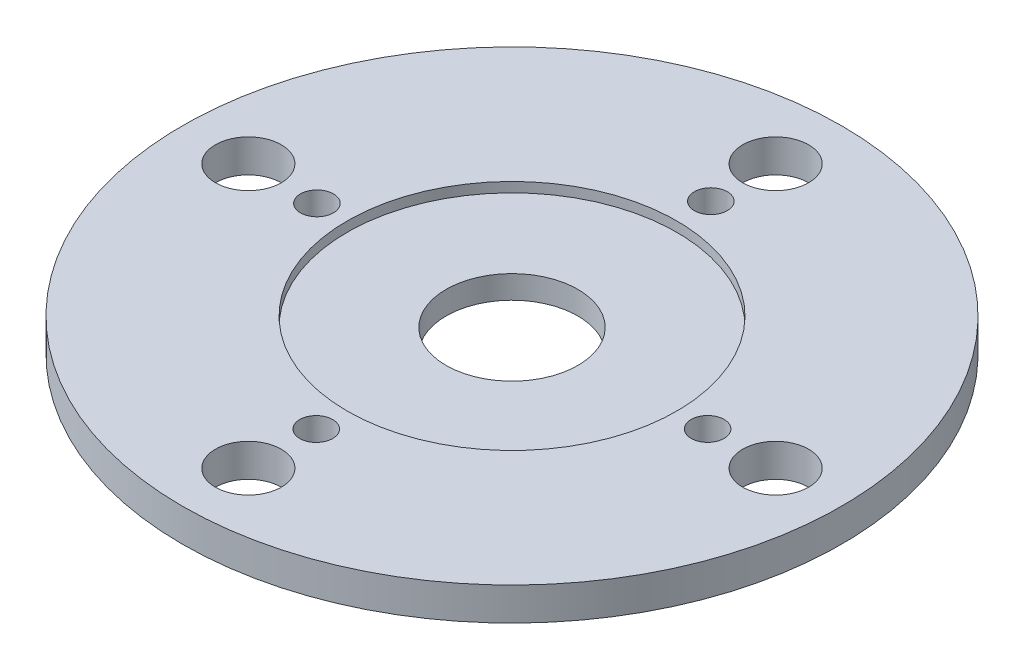
ISO-10303-21;
HEADER;
FILE_DESCRIPTION(('STEP AP214'),'2;1');
FILE_NAME('part.step','',(''),(''),'','','');
FILE_SCHEMA(('AUTOMOTIVE_DESIGN { 1 0 10303 214 1 1 1 1 }'));
ENDSEC;
DATA;
#1=APPLICATION_CONTEXT('core data for automotive mechanical design processes');
#2=APPLICATION_PROTOCOL_DEFINITION('international standard','automotive_design',2000,#1);
#3=PRODUCT_CONTEXT('',#1,'mechanical');
#4=PRODUCT('Part','Part','',(#3));
#5=PRODUCT_RELATED_PRODUCT_CATEGORY('part','',(#4));
#6=PRODUCT_DEFINITION_FORMATION('','',#4);
#7=PRODUCT_DEFINITION_CONTEXT('part definition',#1,'design');
#8=PRODUCT_DEFINITION('design','',#6,#7);
#9=PRODUCT_DEFINITION_SHAPE('','',#8);
#10=(LENGTH_UNIT() NAMED_UNIT(*) SI_UNIT(.MILLI.,.METRE.));
#11=(NAMED_UNIT(*) PLANE_ANGLE_UNIT() SI_UNIT($,.RADIAN.));
#12=(NAMED_UNIT(*) SI_UNIT($,.STERADIAN.) SOLID_ANGLE_UNIT());
#13=UNCERTAINTY_MEASURE_WITH_UNIT(LENGTH_MEASURE(1.E-05),#10,'distance_accuracy_value','');
#14=(GEOMETRIC_REPRESENTATION_CONTEXT(3) GLOBAL_UNCERTAINTY_ASSIGNED_CONTEXT((#13)) GLOBAL_UNIT_ASSIGNED_CONTEXT((#10,
#11,#12)) REPRESENTATION_CONTEXT('',''));
#15=CARTESIAN_POINT('',(0.,0.,0.));
#16=DIRECTION('',(0.,0.,1.));
#17=DIRECTION('',(1.,0.,0.));
#18=AXIS2_PLACEMENT_3D('',#15,#16,#17);
#19=CARTESIAN_POINT('',(0.,1.,0.));
#20=DIRECTION('',(0.,-1.,0.));
#21=DIRECTION('',(0.,0.,-1.));
#22=AXIS2_PLACEMENT_3D('',#19,#20,#21);
#23=CYLINDRICAL_SURFACE('',#22,2.);
#24=CARTESIAN_POINT('',(0.,0.,0.));
#25=DIRECTION('',(0.,1.,0.));
#26=DIRECTION('',(0.,0.,1.));
#27=AXIS2_PLACEMENT_3D('',#24,#25,#26);
#28=CIRCLE('',#27,2.);
#29=CARTESIAN_POINT('',(0.,0.,2.));
#30=VERTEX_POINT('',#29);
#31=EDGE_CURVE('E43',#30,#30,#28,.T.);
#32=ORIENTED_EDGE('',*,*,#31,.F.);
#33=EDGE_LOOP('',(#32));
#34=FACE_BOUND('',#33,.T.);
#35=CARTESIAN_POINT('',(0.,0.7,0.));
#36=DIRECTION('',(0.,1.,0.));
#37=DIRECTION('',(0.,0.,1.));
#38=AXIS2_PLACEMENT_3D('',#35,#36,#37);
#39=CIRCLE('',#38,2.);
#40=CARTESIAN_POINT('',(0.,0.7,2.));
#41=VERTEX_POINT('',#40);
#42=EDGE_CURVE('E34',#41,#41,#39,.T.);
#43=ORIENTED_EDGE('',*,*,#42,.T.);
#44=EDGE_LOOP('',(#43));
#45=FACE_BOUND('',#44,.T.);
#46=ADVANCED_FACE('F30',(#34,#45),#23,.F.);
#47=CARTESIAN_POINT('',(0.,1.,0.));
#48=DIRECTION('',(0.,1.,0.));
#49=DIRECTION('',(0.,0.,1.));
#50=AXIS2_PLACEMENT_3D('',#47,#48,#49);
#51=PLANE('',#50);
#52=CARTESIAN_POINT('',(0.,1.,0.));
#53=DIRECTION('',(0.,1.,0.));
#54=DIRECTION('',(0.,0.,1.));
#55=AXIS2_PLACEMENT_3D('',#52,#53,#54);
#56=CIRCLE('',#55,5.);
#57=CARTESIAN_POINT('',(0.,1.,5.));
#58=VERTEX_POINT('',#57);
#59=EDGE_CURVE('E95',#58,#58,#56,.T.);
#60=ORIENTED_EDGE('',*,*,#59,.F.);
#61=EDGE_LOOP('',(#60));
#62=FACE_BOUND('',#61,.T.);
#63=CARTESIAN_POINT('',(-2.8421709430404E-11,1.,-6.03335240026581));
#64=DIRECTION('',(0.,1.,0.));
#65=DIRECTION('',(0.,0.,1.));
#66=AXIS2_PLACEMENT_3D('',#63,#64,#65);
#67=CIRCLE('',#66,0.499999999999999);
#68=CARTESIAN_POINT('',(-2.8421709430404E-11,1.,-5.53335240026581));
#69=VERTEX_POINT('',#68);
#70=EDGE_CURVE('E81',#69,#69,#67,.T.);
#71=ORIENTED_EDGE('',*,*,#70,.F.);
#72=EDGE_LOOP('',(#71));
#73=FACE_BOUND('',#72,.T.);
#74=CARTESIAN_POINT('',(5.93682324591782,1.,-2.8421709430404E-11));
#75=DIRECTION('',(0.,1.,0.));
#76=DIRECTION('',(0.,0.,-1.));
#77=AXIS2_PLACEMENT_3D('',#74,#75,#76);
#78=CIRCLE('',#77,0.5);
#79=CARTESIAN_POINT('',(5.93682324591782,1.,-0.500000000028421));
#80=VERTEX_POINT('',#79);
#81=EDGE_CURVE('E69',#80,#80,#78,.T.);
#82=ORIENTED_EDGE('',*,*,#81,.F.);
#83=EDGE_LOOP('',(#82));
#84=FACE_BOUND('',#83,.T.);
#85=CARTESIAN_POINT('',(0.,1.,5.94141571224327));
#86=DIRECTION('',(0.,1.,0.));
#87=DIRECTION('',(0.,0.,-1.));
#88=AXIS2_PLACEMENT_3D('',#85,#86,#87);
#89=CIRCLE('',#88,0.500000000000001);
#90=CARTESIAN_POINT('',(0.,1.,5.44141571224327));
#91=VERTEX_POINT('',#90);
#92=EDGE_CURVE('E57',#91,#91,#89,.T.);
#93=ORIENTED_EDGE('',*,*,#92,.F.);
#94=EDGE_LOOP('',(#93));
#95=FACE_BOUND('',#94,.T.);
#96=CARTESIAN_POINT('',(-8.,1.,0.));
#97=DIRECTION('',(0.,1.,0.));
#98=DIRECTION('',(0.,0.,1.));
#99=AXIS2_PLACEMENT_3D('',#96,#97,#98);
#100=CIRCLE('',#99,1.);
#101=CARTESIAN_POINT('',(-8.,1.,1.));
#102=VERTEX_POINT('',#101);
#103=EDGE_CURVE('E47',#102,#102,#100,.T.);
#104=ORIENTED_EDGE('',*,*,#103,.F.);
#105=EDGE_LOOP('',(#104));
#106=FACE_BOUND('',#105,.T.);
#107=CARTESIAN_POINT('',(0.,1.,0.));
#108=DIRECTION('',(0.,1.,0.));
#109=DIRECTION('',(0.,0.,1.));
#110=AXIS2_PLACEMENT_3D('',#107,#108,#109);
#111=CIRCLE('',#110,10.);
#112=CARTESIAN_POINT('',(0.,1.,10.));
#113=VERTEX_POINT('',#112);
#114=EDGE_CURVE('E10',#113,#113,#111,.T.);
#115=ORIENTED_EDGE('',*,*,#114,.T.);
#116=EDGE_LOOP('',(#115));
#117=FACE_BOUND('',#116,.T.);
#118=CARTESIAN_POINT('',(-5.91917261272101,1.,0.));
#119=DIRECTION('',(0.,1.,0.));
#120=DIRECTION('',(0.,0.,1.));
#121=AXIS2_PLACEMENT_3D('',#118,#119,#120);
#122=CIRCLE('',#121,0.5);
#123=CARTESIAN_POINT('',(-5.91917261272101,1.,0.5));
#124=VERTEX_POINT('',#123);
#125=EDGE_CURVE('E51',#124,#124,#122,.T.);
#126=ORIENTED_EDGE('',*,*,#125,.F.);
#127=EDGE_LOOP('',(#126));
#128=FACE_BOUND('',#127,.T.);
#129=CARTESIAN_POINT('',(0.,1.,8.));
#130=DIRECTION('',(0.,1.,0.));
#131=DIRECTION('',(0.,0.,-1.));
#132=AXIS2_PLACEMENT_3D('',#129,#130,#131);
#133=CIRCLE('',#132,1.);
#134=CARTESIAN_POINT('',(0.,1.,7.));
#135=VERTEX_POINT('',#134);
#136=EDGE_CURVE('E63',#135,#135,#133,.T.);
#137=ORIENTED_EDGE('',*,*,#136,.F.);
#138=EDGE_LOOP('',(#137));
#139=FACE_BOUND('',#138,.T.);
#140=CARTESIAN_POINT('',(8.,1.,0.));
#141=DIRECTION('',(0.,1.,0.));
#142=DIRECTION('',(0.,0.,-1.));
#143=AXIS2_PLACEMENT_3D('',#140,#141,#142);
#144=CIRCLE('',#143,1.);
#145=CARTESIAN_POINT('',(8.,1.,-1.));
#146=VERTEX_POINT('',#145);
#147=EDGE_CURVE('E75',#146,#146,#144,.T.);
#148=ORIENTED_EDGE('',*,*,#147,.F.);
#149=EDGE_LOOP('',(#148));
#150=FACE_BOUND('',#149,.T.);
#151=CARTESIAN_POINT('',(0.,1.,-8.));
#152=DIRECTION('',(0.,1.,0.));
#153=DIRECTION('',(0.,0.,1.));
#154=AXIS2_PLACEMENT_3D('',#151,#152,#153);
#155=CIRCLE('',#154,1.);
#156=CARTESIAN_POINT('',(0.,1.,-7.));
#157=VERTEX_POINT('',#156);
#158=EDGE_CURVE('E87',#157,#157,#155,.T.);
#159=ORIENTED_EDGE('',*,*,#158,.F.);
#160=EDGE_LOOP('',(#159));
#161=FACE_BOUND('',#160,.T.);
#162=ADVANCED_FACE('F117',(#62,#73,#84,#95,#106,#117,#128,#139,#150,#161),#51,.T.);
#163=CARTESIAN_POINT('',(0.,0.,0.));
#164=DIRECTION('',(0.,1.,0.));
#165=DIRECTION('',(0.,0.,1.));
#166=AXIS2_PLACEMENT_3D('',#163,#164,#165);
#167=PLANE('',#166);
#168=CARTESIAN_POINT('',(0.,0.,0.));
#169=DIRECTION('',(0.,1.,0.));
#170=DIRECTION('',(0.,0.,1.));
#171=AXIS2_PLACEMENT_3D('',#168,#169,#170);
#172=CIRCLE('',#171,10.);
#173=CARTESIAN_POINT('',(0.,0.,10.));
#174=VERTEX_POINT('',#173);
#175=EDGE_CURVE('E38',#174,#174,#172,.T.);
#176=ORIENTED_EDGE('',*,*,#175,.F.);
#177=EDGE_LOOP('',(#176));
#178=FACE_BOUND('',#177,.T.);
#179=ORIENTED_EDGE('',*,*,#31,.T.);
#180=EDGE_LOOP('',(#179));
#181=FACE_BOUND('',#180,.T.);
#182=CARTESIAN_POINT('',(-8.,0.,0.));
#183=DIRECTION('',(0.,1.,0.));
#184=DIRECTION('',(0.,0.,1.));
#185=AXIS2_PLACEMENT_3D('',#182,#183,#184);
#186=CIRCLE('',#185,1.);
#187=CARTESIAN_POINT('',(-8.,0.,1.));
#188=VERTEX_POINT('',#187);
#189=EDGE_CURVE('E48',#188,#188,#186,.T.);
#190=ORIENTED_EDGE('',*,*,#189,.T.);
#191=EDGE_LOOP('',(#190));
#192=FACE_BOUND('',#191,.T.);
#193=CARTESIAN_POINT('',(-5.91917261272101,0.,0.));
#194=DIRECTION('',(0.,1.,0.));
#195=DIRECTION('',(0.,0.,1.));
#196=AXIS2_PLACEMENT_3D('',#193,#194,#195);
#197=CIRCLE('',#196,0.5);
#198=CARTESIAN_POINT('',(-5.91917261272101,0.,0.5));
#199=VERTEX_POINT('',#198);
#200=EDGE_CURVE('E54',#199,#199,#197,.T.);
#201=ORIENTED_EDGE('',*,*,#200,.T.);
#202=EDGE_LOOP('',(#201));
#203=FACE_BOUND('',#202,.T.);
#204=CARTESIAN_POINT('',(0.,0.,5.94141571224327));
#205=DIRECTION('',(0.,1.,0.));
#206=DIRECTION('',(0.,0.,-1.));
#207=AXIS2_PLACEMENT_3D('',#204,#205,#206);
#208=CIRCLE('',#207,0.500000000000001);
#209=CARTESIAN_POINT('',(0.,0.,5.44141571224327));
#210=VERTEX_POINT('',#209);
#211=EDGE_CURVE('E60',#210,#210,#208,.T.);
#212=ORIENTED_EDGE('',*,*,#211,.T.);
#213=EDGE_LOOP('',(#212));
#214=FACE_BOUND('',#213,.T.);
#215=CARTESIAN_POINT('',(0.,0.,8.));
#216=DIRECTION('',(0.,1.,0.));
#217=DIRECTION('',(0.,0.,-1.));
#218=AXIS2_PLACEMENT_3D('',#215,#216,#217);
#219=CIRCLE('',#218,1.);
#220=CARTESIAN_POINT('',(0.,0.,7.));
#221=VERTEX_POINT('',#220);
#222=EDGE_CURVE('E66',#221,#221,#219,.T.);
#223=ORIENTED_EDGE('',*,*,#222,.T.);
#224=EDGE_LOOP('',(#223));
#225=FACE_BOUND('',#224,.T.);
#226=CARTESIAN_POINT('',(5.93682324591782,0.,-2.8421709430404E-11));
#227=DIRECTION('',(0.,1.,0.));
#228=DIRECTION('',(0.,0.,-1.));
#229=AXIS2_PLACEMENT_3D('',#226,#227,#228);
#230=CIRCLE('',#229,0.5);
#231=CARTESIAN_POINT('',(5.93682324591782,0.,-0.500000000028421));
#232=VERTEX_POINT('',#231);
#233=EDGE_CURVE('E72',#232,#232,#230,.T.);
#234=ORIENTED_EDGE('',*,*,#233,.T.);
#235=EDGE_LOOP('',(#234));
#236=FACE_BOUND('',#235,.T.);
#237=CARTESIAN_POINT('',(8.,0.,0.));
#238=DIRECTION('',(0.,1.,0.));
#239=DIRECTION('',(0.,0.,-1.));
#240=AXIS2_PLACEMENT_3D('',#237,#238,#239);
#241=CIRCLE('',#240,1.);
#242=CARTESIAN_POINT('',(8.,0.,-1.));
#243=VERTEX_POINT('',#242);
#244=EDGE_CURVE('E78',#243,#243,#241,.T.);
#245=ORIENTED_EDGE('',*,*,#244,.T.);
#246=EDGE_LOOP('',(#245));
#247=FACE_BOUND('',#246,.T.);
#248=CARTESIAN_POINT('',(-2.8421709430404E-11,0.,-6.03335240026581));
#249=DIRECTION('',(0.,1.,0.));
#250=DIRECTION('',(0.,0.,1.));
#251=AXIS2_PLACEMENT_3D('',#248,#249,#250);
#252=CIRCLE('',#251,0.499999999999999);
#253=CARTESIAN_POINT('',(-2.8421709430404E-11,0.,-5.53335240026581));
#254=VERTEX_POINT('',#253);
#255=EDGE_CURVE('E84',#254,#254,#252,.T.);
#256=ORIENTED_EDGE('',*,*,#255,.T.);
#257=EDGE_LOOP('',(#256));
#258=FACE_BOUND('',#257,.T.);
#259=CARTESIAN_POINT('',(0.,0.,-8.));
#260=DIRECTION('',(0.,1.,0.));
#261=DIRECTION('',(0.,0.,1.));
#262=AXIS2_PLACEMENT_3D('',#259,#260,#261);
#263=CIRCLE('',#262,1.);
#264=CARTESIAN_POINT('',(0.,0.,-7.));
#265=VERTEX_POINT('',#264);
#266=EDGE_CURVE('E90',#265,#265,#263,.T.);
#267=ORIENTED_EDGE('',*,*,#266,.T.);
#268=EDGE_LOOP('',(#267));
#269=FACE_BOUND('',#268,.T.);
#270=ADVANCED_FACE('F123',(#178,#181,#192,#203,#214,#225,#236,#247,#258,#269),#167,.F.);
#271=CARTESIAN_POINT('',(0.,1.,0.));
#272=DIRECTION('',(0.,-1.,0.));
#273=DIRECTION('',(0.,0.,-1.));
#274=AXIS2_PLACEMENT_3D('',#271,#272,#273);
#275=CYLINDRICAL_SURFACE('',#274,10.);
#276=ORIENTED_EDGE('',*,*,#114,.F.);
#277=EDGE_LOOP('',(#276));
#278=FACE_BOUND('',#277,.T.);
#279=ORIENTED_EDGE('',*,*,#175,.T.);
#280=EDGE_LOOP('',(#279));
#281=FACE_BOUND('',#280,.T.);
#282=ADVANCED_FACE('F32',(#278,#281),#275,.T.);
#283=CARTESIAN_POINT('',(-8.,1.,0.));
#284=DIRECTION('',(0.,-1.,0.));
#285=DIRECTION('',(0.,0.,-1.));
#286=AXIS2_PLACEMENT_3D('',#283,#284,#285);
#287=CYLINDRICAL_SURFACE('',#286,1.);
#288=ORIENTED_EDGE('',*,*,#103,.T.);
#289=EDGE_LOOP('',(#288));
#290=FACE_BOUND('',#289,.T.);
#291=ORIENTED_EDGE('',*,*,#189,.F.);
#292=EDGE_LOOP('',(#291));
#293=FACE_BOUND('',#292,.T.);
#294=ADVANCED_FACE('F128',(#290,#293),#287,.F.);
#295=CARTESIAN_POINT('',(-5.91917261272101,1.,0.));
#296=DIRECTION('',(0.,-1.,0.));
#297=DIRECTION('',(0.,0.,-1.));
#298=AXIS2_PLACEMENT_3D('',#295,#296,#297);
#299=CYLINDRICAL_SURFACE('',#298,0.5);
#300=ORIENTED_EDGE('',*,*,#125,.T.);
#301=EDGE_LOOP('',(#300));
#302=FACE_BOUND('',#301,.T.);
#303=ORIENTED_EDGE('',*,*,#200,.F.);
#304=EDGE_LOOP('',(#303));
#305=FACE_BOUND('',#304,.T.);
#306=ADVANCED_FACE('F179',(#302,#305),#299,.F.);
#307=CARTESIAN_POINT('',(0.,1.,5.94141571224327));
#308=DIRECTION('',(0.,-1.,0.));
#309=DIRECTION('',(0.,0.,-1.));
#310=AXIS2_PLACEMENT_3D('',#307,#308,#309);
#311=CYLINDRICAL_SURFACE('',#310,0.500000000000001);
#312=ORIENTED_EDGE('',*,*,#92,.T.);
#313=EDGE_LOOP('',(#312));
#314=FACE_BOUND('',#313,.T.);
#315=ORIENTED_EDGE('',*,*,#211,.F.);
#316=EDGE_LOOP('',(#315));
#317=FACE_BOUND('',#316,.T.);
#318=ADVANCED_FACE('F176',(#314,#317),#311,.F.);
#319=CARTESIAN_POINT('',(0.,1.,8.));
#320=DIRECTION('',(0.,-1.,0.));
#321=DIRECTION('',(0.,0.,-1.));
#322=AXIS2_PLACEMENT_3D('',#319,#320,#321);
#323=CYLINDRICAL_SURFACE('',#322,1.);
#324=ORIENTED_EDGE('',*,*,#136,.T.);
#325=EDGE_LOOP('',(#324));
#326=FACE_BOUND('',#325,.T.);
#327=ORIENTED_EDGE('',*,*,#222,.F.);
#328=EDGE_LOOP('',(#327));
#329=FACE_BOUND('',#328,.T.);
#330=ADVANCED_FACE('F172',(#326,#329),#323,.F.);
#331=CARTESIAN_POINT('',(5.93682324591782,1.,-2.8421709430404E-11));
#332=DIRECTION('',(0.,-1.,0.));
#333=DIRECTION('',(0.,0.,-1.));
#334=AXIS2_PLACEMENT_3D('',#331,#332,#333);
#335=CYLINDRICAL_SURFACE('',#334,0.5);
#336=ORIENTED_EDGE('',*,*,#81,.T.);
#337=EDGE_LOOP('',(#336));
#338=FACE_BOUND('',#337,.T.);
#339=ORIENTED_EDGE('',*,*,#233,.F.);
#340=EDGE_LOOP('',(#339));
#341=FACE_BOUND('',#340,.T.);
#342=ADVANCED_FACE('F168',(#338,#341),#335,.F.);
#343=CARTESIAN_POINT('',(8.,1.,0.));
#344=DIRECTION('',(0.,-1.,0.));
#345=DIRECTION('',(0.,0.,-1.));
#346=AXIS2_PLACEMENT_3D('',#343,#344,#345);
#347=CYLINDRICAL_SURFACE('',#346,1.);
#348=ORIENTED_EDGE('',*,*,#147,.T.);
#349=EDGE_LOOP('',(#348));
#350=FACE_BOUND('',#349,.T.);
#351=ORIENTED_EDGE('',*,*,#244,.F.);
#352=EDGE_LOOP('',(#351));
#353=FACE_BOUND('',#352,.T.);
#354=ADVANCED_FACE('F162',(#350,#353),#347,.F.);
#355=CARTESIAN_POINT('',(-2.8421709430404E-11,1.,-6.03335240026581));
#356=DIRECTION('',(0.,-1.,0.));
#357=DIRECTION('',(0.,0.,-1.));
#358=AXIS2_PLACEMENT_3D('',#355,#356,#357);
#359=CYLINDRICAL_SURFACE('',#358,0.499999999999999);
#360=ORIENTED_EDGE('',*,*,#70,.T.);
#361=EDGE_LOOP('',(#360));
#362=FACE_BOUND('',#361,.T.);
#363=ORIENTED_EDGE('',*,*,#255,.F.);
#364=EDGE_LOOP('',(#363));
#365=FACE_BOUND('',#364,.T.);
#366=ADVANCED_FACE('F156',(#362,#365),#359,.F.);
#367=CARTESIAN_POINT('',(0.,1.,-8.));
#368=DIRECTION('',(0.,-1.,0.));
#369=DIRECTION('',(0.,0.,-1.));
#370=AXIS2_PLACEMENT_3D('',#367,#368,#369);
#371=CYLINDRICAL_SURFACE('',#370,1.);
#372=ORIENTED_EDGE('',*,*,#158,.T.);
#373=EDGE_LOOP('',(#372));
#374=FACE_BOUND('',#373,.T.);
#375=ORIENTED_EDGE('',*,*,#266,.F.);
#376=EDGE_LOOP('',(#375));
#377=FACE_BOUND('',#376,.T.);
#378=ADVANCED_FACE('F113',(#374,#377),#371,.F.);
#379=CARTESIAN_POINT('',(0.,0.7,0.));
#380=DIRECTION('',(0.,1.,0.));
#381=DIRECTION('',(0.,0.,1.));
#382=AXIS2_PLACEMENT_3D('',#379,#380,#381);
#383=CYLINDRICAL_SURFACE('',#382,5.);
#384=CARTESIAN_POINT('',(0.,0.7,0.));
#385=DIRECTION('',(0.,1.,0.));
#386=DIRECTION('',(0.,0.,1.));
#387=AXIS2_PLACEMENT_3D('',#384,#385,#386);
#388=CIRCLE('',#387,5.);
#389=CARTESIAN_POINT('',(0.,0.7,5.));
#390=VERTEX_POINT('',#389);
#391=EDGE_CURVE('E98',#390,#390,#388,.T.);
#392=ORIENTED_EDGE('',*,*,#391,.F.);
#393=EDGE_LOOP('',(#392));
#394=FACE_BOUND('',#393,.T.);
#395=ORIENTED_EDGE('',*,*,#59,.T.);
#396=EDGE_LOOP('',(#395));
#397=FACE_BOUND('',#396,.T.);
#398=ADVANCED_FACE('F108',(#394,#397),#383,.F.);
#399=CARTESIAN_POINT('',(0.,0.7,0.));
#400=DIRECTION('',(0.,1.,0.));
#401=DIRECTION('',(0.,0.,1.));
#402=AXIS2_PLACEMENT_3D('',#399,#400,#401);
#403=PLANE('',#402);
#404=ORIENTED_EDGE('',*,*,#42,.F.);
#405=EDGE_LOOP('',(#404));
#406=FACE_BOUND('',#405,.T.);
#407=ORIENTED_EDGE('',*,*,#391,.T.);
#408=EDGE_LOOP('',(#407));
#409=FACE_BOUND('',#408,.T.);
#410=ADVANCED_FACE('F106',(#406,#409),#403,.T.);
#411=CLOSED_SHELL('',(#46,#162,#270,#282,#294,#306,#318,#330,#342,#354,#366,#378,#398,#410));
#412=MANIFOLD_SOLID_BREP('B2',#411);
#413=ADVANCED_BREP_SHAPE_REPRESENTATION('',(#18,#412),#14);
#414=SHAPE_DEFINITION_REPRESENTATION(#9,#413);
ENDSEC;
END-ISO-10303-21;
